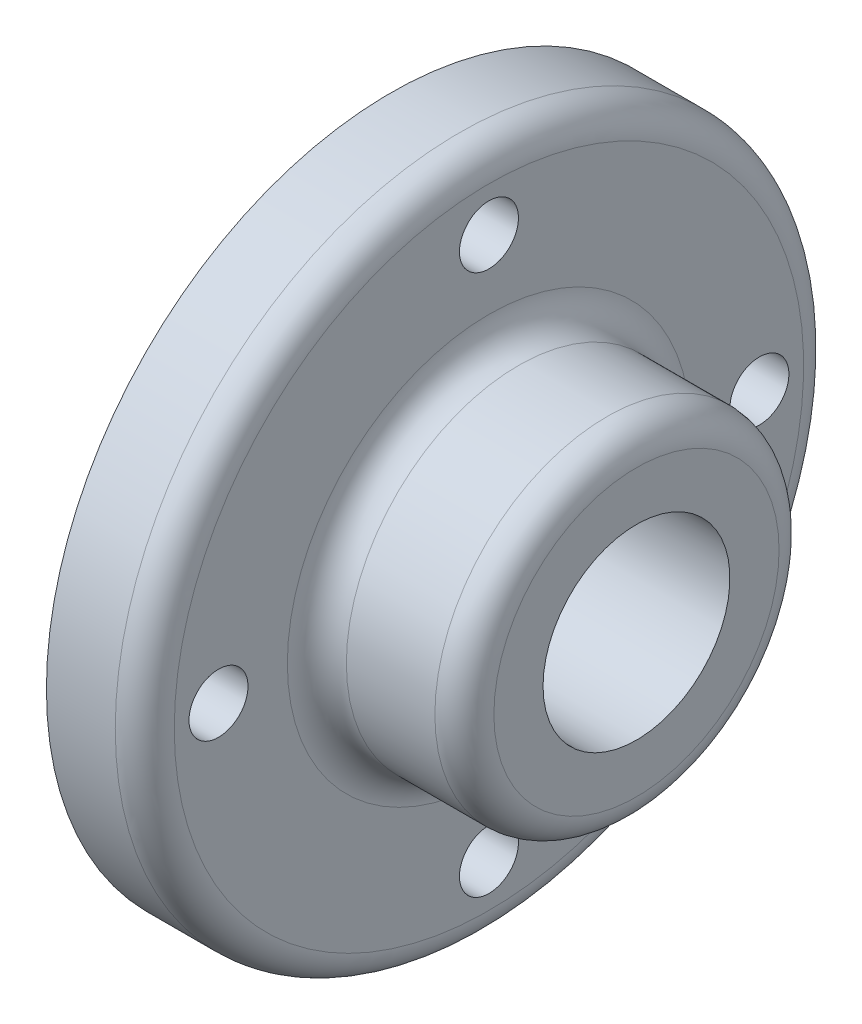
ISO-10303-21;
HEADER;
FILE_DESCRIPTION(('STEP AP214'),'2;1');
FILE_NAME('part.step','',(''),(''),'','','');
FILE_SCHEMA(('AUTOMOTIVE_DESIGN { 1 0 10303 214 1 1 1 1 }'));
ENDSEC;
DATA;
#1=APPLICATION_CONTEXT('core data for automotive mechanical design processes');
#2=APPLICATION_PROTOCOL_DEFINITION('international standard','automotive_design',2000,#1);
#3=PRODUCT_CONTEXT('',#1,'mechanical');
#4=PRODUCT('Part','Part','',(#3));
#5=PRODUCT_RELATED_PRODUCT_CATEGORY('part','',(#4));
#6=PRODUCT_DEFINITION_FORMATION('','',#4);
#7=PRODUCT_DEFINITION_CONTEXT('part definition',#1,'design');
#8=PRODUCT_DEFINITION('design','',#6,#7);
#9=PRODUCT_DEFINITION_SHAPE('','',#8);
#10=(LENGTH_UNIT() NAMED_UNIT(*) SI_UNIT(.MILLI.,.METRE.));
#11=(NAMED_UNIT(*) PLANE_ANGLE_UNIT() SI_UNIT($,.RADIAN.));
#12=(NAMED_UNIT(*) SI_UNIT($,.STERADIAN.) SOLID_ANGLE_UNIT());
#13=UNCERTAINTY_MEASURE_WITH_UNIT(LENGTH_MEASURE(1.E-05),#10,'distance_accuracy_value','');
#14=(GEOMETRIC_REPRESENTATION_CONTEXT(3) GLOBAL_UNCERTAINTY_ASSIGNED_CONTEXT((#13)) GLOBAL_UNIT_ASSIGNED_CONTEXT((#10,
#11,#12)) REPRESENTATION_CONTEXT('',''));
#15=CARTESIAN_POINT('',(0.,0.,0.));
#16=DIRECTION('',(0.,0.,1.));
#17=DIRECTION('',(1.,0.,0.));
#18=AXIS2_PLACEMENT_3D('',#15,#16,#17);
#19=CARTESIAN_POINT('',(0.,0.,0.));
#20=DIRECTION('',(-1.,0.,0.));
#21=DIRECTION('',(0.,0.,1.));
#22=AXIS2_PLACEMENT_3D('',#19,#20,#21);
#23=CYLINDRICAL_SURFACE('',#22,19.);
#24=CARTESIAN_POINT('',(50.,0.,0.));
#25=DIRECTION('',(-1.,0.,0.));
#26=DIRECTION('',(0.,0.,1.));
#27=AXIS2_PLACEMENT_3D('',#24,#25,#26);
#28=CIRCLE('',#27,19.);
#29=CARTESIAN_POINT('',(50.,0.,19.));
#30=VERTEX_POINT('',#29);
#31=EDGE_CURVE('E76',#30,#30,#28,.T.);
#32=ORIENTED_EDGE('',*,*,#31,.F.);
#33=EDGE_LOOP('',(#32));
#34=FACE_BOUND('',#33,.T.);
#35=CARTESIAN_POINT('',(0.,0.,0.));
#36=DIRECTION('',(-1.,0.,0.));
#37=DIRECTION('',(0.,0.,1.));
#38=AXIS2_PLACEMENT_3D('',#35,#36,#37);
#39=CIRCLE('',#38,19.);
#40=CARTESIAN_POINT('',(0.,0.,19.));
#41=VERTEX_POINT('',#40);
#42=EDGE_CURVE('E68',#41,#41,#39,.T.);
#43=ORIENTED_EDGE('',*,*,#42,.T.);
#44=EDGE_LOOP('',(#43));
#45=FACE_BOUND('',#44,.T.);
#46=ADVANCED_FACE('F36',(#34,#45),#23,.F.);
#47=CARTESIAN_POINT('',(0.,19.,0.));
#48=DIRECTION('',(1.,0.,0.));
#49=DIRECTION('',(0.,0.,-1.));
#50=AXIS2_PLACEMENT_3D('',#47,#48,#49);
#51=PLANE('',#50);
#52=CARTESIAN_POINT('',(0.,5.76094420909117E-13,55.));
#53=DIRECTION('',(-1.,0.,0.));
#54=DIRECTION('',(0.,0.,1.));
#55=AXIS2_PLACEMENT_3D('',#52,#53,#54);
#56=CIRCLE('',#55,5.99999999999999);
#57=CARTESIAN_POINT('',(0.,5.76094420909117E-13,61.));
#58=VERTEX_POINT('',#57);
#59=EDGE_CURVE('E108',#58,#58,#56,.T.);
#60=ORIENTED_EDGE('',*,*,#59,.F.);
#61=EDGE_LOOP('',(#60));
#62=FACE_BOUND('',#61,.T.);
#63=CARTESIAN_POINT('',(0.,-55.,0.));
#64=DIRECTION('',(-1.,0.,0.));
#65=DIRECTION('',(0.,0.,1.));
#66=AXIS2_PLACEMENT_3D('',#63,#64,#65);
#67=CIRCLE('',#66,5.99999999999998);
#68=CARTESIAN_POINT('',(0.,-55.,5.99999999999998));
#69=VERTEX_POINT('',#68);
#70=EDGE_CURVE('E100',#69,#69,#67,.T.);
#71=ORIENTED_EDGE('',*,*,#70,.F.);
#72=EDGE_LOOP('',(#71));
#73=FACE_BOUND('',#72,.T.);
#74=CARTESIAN_POINT('',(0.,-1.92031473636372E-13,-55.));
#75=DIRECTION('',(-1.,0.,0.));
#76=DIRECTION('',(0.,0.,1.));
#77=AXIS2_PLACEMENT_3D('',#74,#75,#76);
#78=CIRCLE('',#77,5.99999999999999);
#79=CARTESIAN_POINT('',(0.,-1.92031473636372E-13,-49.));
#80=VERTEX_POINT('',#79);
#81=EDGE_CURVE('E92',#80,#80,#78,.T.);
#82=ORIENTED_EDGE('',*,*,#81,.F.);
#83=EDGE_LOOP('',(#82));
#84=FACE_BOUND('',#83,.T.);
#85=CARTESIAN_POINT('',(0.,55.,0.));
#86=DIRECTION('',(-1.,0.,0.));
#87=DIRECTION('',(0.,0.,1.));
#88=AXIS2_PLACEMENT_3D('',#85,#86,#87);
#89=CIRCLE('',#88,5.99999999999998);
#90=CARTESIAN_POINT('',(0.,55.,5.99999999999998));
#91=VERTEX_POINT('',#90);
#92=EDGE_CURVE('E84',#91,#91,#89,.T.);
#93=ORIENTED_EDGE('',*,*,#92,.F.);
#94=EDGE_LOOP('',(#93));
#95=FACE_BOUND('',#94,.T.);
#96=ORIENTED_EDGE('',*,*,#42,.F.);
#97=EDGE_LOOP('',(#96));
#98=FACE_BOUND('',#97,.T.);
#99=CARTESIAN_POINT('',(0.,0.,0.));
#100=DIRECTION('',(-1.,0.,0.));
#101=DIRECTION('',(0.,0.,1.));
#102=AXIS2_PLACEMENT_3D('',#99,#100,#101);
#103=CIRCLE('',#102,70.);
#104=CARTESIAN_POINT('',(0.,0.,70.));
#105=VERTEX_POINT('',#104);
#106=EDGE_CURVE('E72',#105,#105,#103,.T.);
#107=ORIENTED_EDGE('',*,*,#106,.T.);
#108=EDGE_LOOP('',(#107));
#109=FACE_BOUND('',#108,.T.);
#110=ADVANCED_FACE('F116',(#62,#73,#84,#95,#98,#109),#51,.F.);
#111=CARTESIAN_POINT('',(0.,0.,0.));
#112=DIRECTION('',(-1.,0.,0.));
#113=DIRECTION('',(0.,0.,1.));
#114=AXIS2_PLACEMENT_3D('',#111,#112,#113);
#115=CYLINDRICAL_SURFACE('',#114,70.);
#116=CARTESIAN_POINT('',(14.,0.,0.));
#117=DIRECTION('',(-1.,0.,0.));
#118=DIRECTION('',(0.,0.,1.));
#119=AXIS2_PLACEMENT_3D('',#116,#117,#118);
#120=CIRCLE('',#119,70.);
#121=CARTESIAN_POINT('',(14.,0.,70.));
#122=VERTEX_POINT('',#121);
#123=EDGE_CURVE('E10',#122,#122,#120,.T.);
#124=ORIENTED_EDGE('',*,*,#123,.T.);
#125=EDGE_LOOP('',(#124));
#126=FACE_BOUND('',#125,.T.);
#127=ORIENTED_EDGE('',*,*,#106,.F.);
#128=EDGE_LOOP('',(#127));
#129=FACE_BOUND('',#128,.T.);
#130=ADVANCED_FACE('F119',(#126,#129),#115,.T.);
#131=CARTESIAN_POINT('',(20.,70.,0.));
#132=DIRECTION('',(-1.,0.,0.));
#133=DIRECTION('',(0.,0.,1.));
#134=AXIS2_PLACEMENT_3D('',#131,#132,#133);
#135=PLANE('',#134);
#136=CARTESIAN_POINT('',(20.,5.76094420909117E-13,55.));
#137=DIRECTION('',(-1.,0.,0.));
#138=DIRECTION('',(0.,0.,1.));
#139=AXIS2_PLACEMENT_3D('',#136,#137,#138);
#140=CIRCLE('',#139,5.99999999999999);
#141=CARTESIAN_POINT('',(20.,5.76094420909117E-13,61.));
#142=VERTEX_POINT('',#141);
#143=EDGE_CURVE('E104',#142,#142,#140,.T.);
#144=ORIENTED_EDGE('',*,*,#143,.T.);
#145=EDGE_LOOP('',(#144));
#146=FACE_BOUND('',#145,.T.);
#147=CARTESIAN_POINT('',(20.,-55.,0.));
#148=DIRECTION('',(-1.,0.,0.));
#149=DIRECTION('',(0.,0.,1.));
#150=AXIS2_PLACEMENT_3D('',#147,#148,#149);
#151=CIRCLE('',#150,5.99999999999999);
#152=CARTESIAN_POINT('',(20.,-55.,5.99999999999999));
#153=VERTEX_POINT('',#152);
#154=EDGE_CURVE('E96',#153,#153,#151,.T.);
#155=ORIENTED_EDGE('',*,*,#154,.T.);
#156=EDGE_LOOP('',(#155));
#157=FACE_BOUND('',#156,.T.);
#158=CARTESIAN_POINT('',(20.,-1.92031473636372E-13,-55.));
#159=DIRECTION('',(-1.,0.,0.));
#160=DIRECTION('',(0.,0.,1.));
#161=AXIS2_PLACEMENT_3D('',#158,#159,#160);
#162=CIRCLE('',#161,5.99999999999999);
#163=CARTESIAN_POINT('',(20.,-1.92031473636372E-13,-49.));
#164=VERTEX_POINT('',#163);
#165=EDGE_CURVE('E88',#164,#164,#162,.T.);
#166=ORIENTED_EDGE('',*,*,#165,.T.);
#167=EDGE_LOOP('',(#166));
#168=FACE_BOUND('',#167,.T.);
#169=CARTESIAN_POINT('',(20.,55.,0.));
#170=DIRECTION('',(-1.,0.,0.));
#171=DIRECTION('',(0.,0.,1.));
#172=AXIS2_PLACEMENT_3D('',#169,#170,#171);
#173=CIRCLE('',#172,5.99999999999999);
#174=CARTESIAN_POINT('',(20.,55.,5.99999999999999));
#175=VERTEX_POINT('',#174);
#176=EDGE_CURVE('E80',#175,#175,#173,.T.);
#177=ORIENTED_EDGE('',*,*,#176,.T.);
#178=EDGE_LOOP('',(#177));
#179=FACE_BOUND('',#178,.T.);
#180=CARTESIAN_POINT('',(20.,0.,0.));
#181=DIRECTION('',(-1.,0.,0.));
#182=DIRECTION('',(0.,0.,1.));
#183=AXIS2_PLACEMENT_3D('',#180,#181,#182);
#184=CIRCLE('',#183,41.);
#185=CARTESIAN_POINT('',(20.,0.,41.));
#186=VERTEX_POINT('',#185);
#187=EDGE_CURVE('E44',#186,#186,#184,.T.);
#188=ORIENTED_EDGE('',*,*,#187,.T.);
#189=EDGE_LOOP('',(#188));
#190=FACE_BOUND('',#189,.T.);
#191=CARTESIAN_POINT('',(20.,0.,0.));
#192=DIRECTION('',(-1.,0.,0.));
#193=DIRECTION('',(0.,0.,1.));
#194=AXIS2_PLACEMENT_3D('',#191,#192,#193);
#195=CIRCLE('',#194,64.);
#196=CARTESIAN_POINT('',(20.,0.,64.));
#197=VERTEX_POINT('',#196);
#198=EDGE_CURVE('E49',#197,#197,#195,.F.);
#199=ORIENTED_EDGE('',*,*,#198,.T.);
#200=EDGE_LOOP('',(#199));
#201=FACE_BOUND('',#200,.T.);
#202=ADVANCED_FACE('F132',(#146,#157,#168,#179,#190,#201),#135,.F.);
#203=CARTESIAN_POINT('',(0.,0.,0.));
#204=DIRECTION('',(-1.,0.,0.));
#205=DIRECTION('',(0.,0.,1.));
#206=AXIS2_PLACEMENT_3D('',#203,#204,#205);
#207=CYLINDRICAL_SURFACE('',#206,35.);
#208=CARTESIAN_POINT('',(44.,0.,0.));
#209=DIRECTION('',(-1.,0.,0.));
#210=DIRECTION('',(0.,0.,1.));
#211=AXIS2_PLACEMENT_3D('',#208,#209,#210);
#212=CIRCLE('',#211,35.);
#213=CARTESIAN_POINT('',(44.,0.,35.));
#214=VERTEX_POINT('',#213);
#215=EDGE_CURVE('E60',#214,#214,#212,.T.);
#216=ORIENTED_EDGE('',*,*,#215,.T.);
#217=EDGE_LOOP('',(#216));
#218=FACE_BOUND('',#217,.T.);
#219=CARTESIAN_POINT('',(26.,0.,0.));
#220=DIRECTION('',(-1.,0.,0.));
#221=DIRECTION('',(0.,0.,1.));
#222=AXIS2_PLACEMENT_3D('',#219,#220,#221);
#223=CIRCLE('',#222,35.);
#224=CARTESIAN_POINT('',(26.,0.,35.));
#225=VERTEX_POINT('',#224);
#226=EDGE_CURVE('E64',#225,#225,#223,.F.);
#227=ORIENTED_EDGE('',*,*,#226,.T.);
#228=EDGE_LOOP('',(#227));
#229=FACE_BOUND('',#228,.T.);
#230=ADVANCED_FACE('F137',(#218,#229),#207,.T.);
#231=CARTESIAN_POINT('',(50.,35.,0.));
#232=DIRECTION('',(-1.,0.,0.));
#233=DIRECTION('',(0.,0.,1.));
#234=AXIS2_PLACEMENT_3D('',#231,#232,#233);
#235=PLANE('',#234);
#236=CARTESIAN_POINT('',(50.,0.,0.));
#237=DIRECTION('',(-1.,0.,0.));
#238=DIRECTION('',(0.,0.,1.));
#239=AXIS2_PLACEMENT_3D('',#236,#237,#238);
#240=CIRCLE('',#239,29.);
#241=CARTESIAN_POINT('',(50.,0.,29.));
#242=VERTEX_POINT('',#241);
#243=EDGE_CURVE('E54',#242,#242,#240,.F.);
#244=ORIENTED_EDGE('',*,*,#243,.T.);
#245=EDGE_LOOP('',(#244));
#246=FACE_BOUND('',#245,.T.);
#247=ORIENTED_EDGE('',*,*,#31,.T.);
#248=EDGE_LOOP('',(#247));
#249=FACE_BOUND('',#248,.T.);
#250=ADVANCED_FACE('F151',(#246,#249),#235,.F.);
#251=CARTESIAN_POINT('',(44.,0.,0.));
#252=DIRECTION('',(-1.,0.,0.));
#253=DIRECTION('',(0.,0.,1.));
#254=AXIS2_PLACEMENT_3D('',#251,#252,#253);
#255=TOROIDAL_SURFACE('',#254,29.,6.);
#256=ORIENTED_EDGE('',*,*,#243,.F.);
#257=EDGE_LOOP('',(#256));
#258=FACE_BOUND('',#257,.T.);
#259=ORIENTED_EDGE('',*,*,#215,.F.);
#260=EDGE_LOOP('',(#259));
#261=FACE_BOUND('',#260,.T.);
#262=ADVANCED_FACE('F148',(#258,#261),#255,.T.);
#263=CARTESIAN_POINT('',(26.,0.,0.));
#264=DIRECTION('',(-1.,0.,0.));
#265=DIRECTION('',(0.,0.,1.));
#266=AXIS2_PLACEMENT_3D('',#263,#264,#265);
#267=TOROIDAL_SURFACE('',#266,41.,6.);
#268=ORIENTED_EDGE('',*,*,#226,.F.);
#269=EDGE_LOOP('',(#268));
#270=FACE_BOUND('',#269,.T.);
#271=ORIENTED_EDGE('',*,*,#187,.F.);
#272=EDGE_LOOP('',(#271));
#273=FACE_BOUND('',#272,.T.);
#274=ADVANCED_FACE('F150',(#270,#273),#267,.F.);
#275=CARTESIAN_POINT('',(14.,0.,0.));
#276=DIRECTION('',(-1.,0.,0.));
#277=DIRECTION('',(0.,0.,1.));
#278=AXIS2_PLACEMENT_3D('',#275,#276,#277);
#279=TOROIDAL_SURFACE('',#278,64.,6.);
#280=ORIENTED_EDGE('',*,*,#198,.F.);
#281=EDGE_LOOP('',(#280));
#282=FACE_BOUND('',#281,.T.);
#283=ORIENTED_EDGE('',*,*,#123,.F.);
#284=EDGE_LOOP('',(#283));
#285=FACE_BOUND('',#284,.T.);
#286=ADVANCED_FACE('F38',(#282,#285),#279,.T.);
#287=CARTESIAN_POINT('',(0.,55.,0.));
#288=DIRECTION('',(-1.,0.,0.));
#289=DIRECTION('',(0.,0.,1.));
#290=AXIS2_PLACEMENT_3D('',#287,#288,#289);
#291=CYLINDRICAL_SURFACE('',#290,5.99999999999999);
#292=ORIENTED_EDGE('',*,*,#92,.T.);
#293=EDGE_LOOP('',(#292));
#294=FACE_BOUND('',#293,.T.);
#295=ORIENTED_EDGE('',*,*,#176,.F.);
#296=EDGE_LOOP('',(#295));
#297=FACE_BOUND('',#296,.T.);
#298=ADVANCED_FACE('F158',(#294,#297),#291,.F.);
#299=CARTESIAN_POINT('',(0.,-1.92031473636372E-13,-55.));
#300=DIRECTION('',(-1.,0.,0.));
#301=DIRECTION('',(0.,0.,1.));
#302=AXIS2_PLACEMENT_3D('',#299,#300,#301);
#303=CYLINDRICAL_SURFACE('',#302,5.99999999999999);
#304=ORIENTED_EDGE('',*,*,#81,.T.);
#305=EDGE_LOOP('',(#304));
#306=FACE_BOUND('',#305,.T.);
#307=ORIENTED_EDGE('',*,*,#165,.F.);
#308=EDGE_LOOP('',(#307));
#309=FACE_BOUND('',#308,.T.);
#310=ADVANCED_FACE('F174',(#306,#309),#303,.F.);
#311=CARTESIAN_POINT('',(0.,-55.,0.));
#312=DIRECTION('',(-1.,0.,0.));
#313=DIRECTION('',(0.,0.,1.));
#314=AXIS2_PLACEMENT_3D('',#311,#312,#313);
#315=CYLINDRICAL_SURFACE('',#314,5.99999999999999);
#316=ORIENTED_EDGE('',*,*,#70,.T.);
#317=EDGE_LOOP('',(#316));
#318=FACE_BOUND('',#317,.T.);
#319=ORIENTED_EDGE('',*,*,#154,.F.);
#320=EDGE_LOOP('',(#319));
#321=FACE_BOUND('',#320,.T.);
#322=ADVANCED_FACE('F178',(#318,#321),#315,.F.);
#323=CARTESIAN_POINT('',(0.,5.76094420909117E-13,55.));
#324=DIRECTION('',(-1.,0.,0.));
#325=DIRECTION('',(0.,0.,1.));
#326=AXIS2_PLACEMENT_3D('',#323,#324,#325);
#327=CYLINDRICAL_SURFACE('',#326,5.99999999999999);
#328=ORIENTED_EDGE('',*,*,#59,.T.);
#329=EDGE_LOOP('',(#328));
#330=FACE_BOUND('',#329,.T.);
#331=ORIENTED_EDGE('',*,*,#143,.F.);
#332=EDGE_LOOP('',(#331));
#333=FACE_BOUND('',#332,.T.);
#334=ADVANCED_FACE('F113',(#330,#333),#327,.F.);
#335=CLOSED_SHELL('',(#46,#110,#130,#202,#230,#250,#262,#274,#286,#298,#310,#322,#334));
#336=MANIFOLD_SOLID_BREP('B2',#335);
#337=ADVANCED_BREP_SHAPE_REPRESENTATION('',(#18,#336),#14);
#338=SHAPE_DEFINITION_REPRESENTATION(#9,#337);
ENDSEC;
END-ISO-10303-21;
